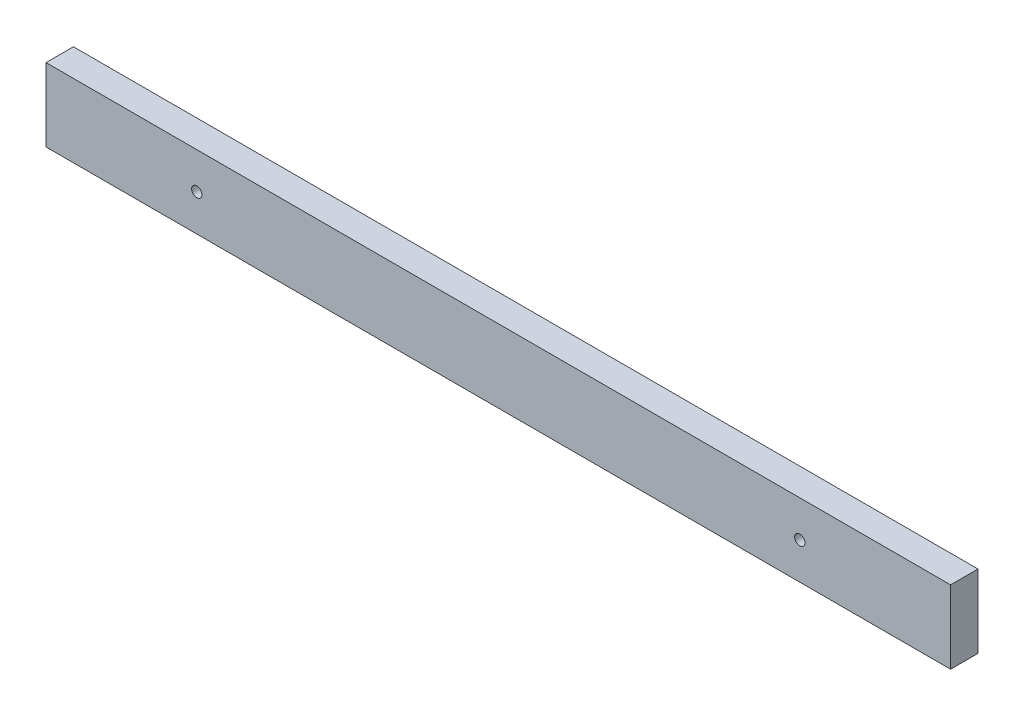
ISO-10303-21;
HEADER;
FILE_DESCRIPTION(('STEP AP214'),'2;1');
FILE_NAME('part.step','',(''),(''),'','','');
FILE_SCHEMA(('AUTOMOTIVE_DESIGN { 1 0 10303 214 1 1 1 1 }'));
ENDSEC;
DATA;
#1=APPLICATION_CONTEXT('core data for automotive mechanical design processes');
#2=APPLICATION_PROTOCOL_DEFINITION('international standard','automotive_design',2000,#1);
#3=PRODUCT_CONTEXT('',#1,'mechanical');
#4=PRODUCT('Part','Part','',(#3));
#5=PRODUCT_RELATED_PRODUCT_CATEGORY('part','',(#4));
#6=PRODUCT_DEFINITION_FORMATION('','',#4);
#7=PRODUCT_DEFINITION_CONTEXT('part definition',#1,'design');
#8=PRODUCT_DEFINITION('design','',#6,#7);
#9=PRODUCT_DEFINITION_SHAPE('','',#8);
#10=(LENGTH_UNIT() NAMED_UNIT(*) SI_UNIT(.MILLI.,.METRE.));
#11=(NAMED_UNIT(*) PLANE_ANGLE_UNIT() SI_UNIT($,.RADIAN.));
#12=(NAMED_UNIT(*) SI_UNIT($,.STERADIAN.) SOLID_ANGLE_UNIT());
#13=UNCERTAINTY_MEASURE_WITH_UNIT(LENGTH_MEASURE(1.E-05),#10,'distance_accuracy_value','');
#14=(GEOMETRIC_REPRESENTATION_CONTEXT(3) GLOBAL_UNCERTAINTY_ASSIGNED_CONTEXT((#13)) GLOBAL_UNIT_ASSIGNED_CONTEXT((#10,
#11,#12)) REPRESENTATION_CONTEXT('',''));
#15=CARTESIAN_POINT('',(0.,0.,0.));
#16=DIRECTION('',(0.,0.,1.));
#17=DIRECTION('',(1.,0.,0.));
#18=AXIS2_PLACEMENT_3D('',#15,#16,#17);
#19=CARTESIAN_POINT('',(-99.,16.,-3.));
#20=DIRECTION('',(1.,0.,0.));
#21=DIRECTION('',(0.,0.,-1.));
#22=AXIS2_PLACEMENT_3D('',#19,#20,#21);
#23=PLANE('',#22);
#24=DIRECTION('',(0.,0.,1.));
#25=VECTOR('',#24,1.);
#26=CARTESIAN_POINT('',(-99.,0.,-3.));
#27=LINE('',#26,#25);
#28=CARTESIAN_POINT('',(-99.,0.,-3.));
#29=VERTEX_POINT('',#28);
#30=CARTESIAN_POINT('',(-99.,0.,3.));
#31=VERTEX_POINT('',#30);
#32=EDGE_CURVE('E98',#29,#31,#27,.T.);
#33=ORIENTED_EDGE('',*,*,#32,.T.);
#34=DIRECTION('',(0.,-1.,0.));
#35=VECTOR('',#34,1.);
#36=CARTESIAN_POINT('',(-99.,16.,3.));
#37=LINE('',#36,#35);
#38=CARTESIAN_POINT('',(-99.,16.,3.));
#39=VERTEX_POINT('',#38);
#40=EDGE_CURVE('E11',#39,#31,#37,.T.);
#41=ORIENTED_EDGE('',*,*,#40,.F.);
#42=DIRECTION('',(0.,0.,1.));
#43=VECTOR('',#42,1.);
#44=CARTESIAN_POINT('',(-99.,16.,-3.));
#45=LINE('',#44,#43);
#46=CARTESIAN_POINT('',(-99.,16.,-3.));
#47=VERTEX_POINT('',#46);
#48=EDGE_CURVE('E85',#47,#39,#45,.T.);
#49=ORIENTED_EDGE('',*,*,#48,.F.);
#50=DIRECTION('',(0.,-1.,0.));
#51=VECTOR('',#50,1.);
#52=CARTESIAN_POINT('',(-99.,16.,-3.));
#53=LINE('',#52,#51);
#54=EDGE_CURVE('E94',#47,#29,#53,.T.);
#55=ORIENTED_EDGE('',*,*,#54,.T.);
#56=EDGE_LOOP('',(#33,#41,#49,#55));
#57=FACE_BOUND('',#56,.T.);
#58=ADVANCED_FACE('F32',(#57),#23,.F.);
#59=CARTESIAN_POINT('',(-99.,16.,3.));
#60=DIRECTION('',(0.,0.,-1.));
#61=DIRECTION('',(-1.,0.,0.));
#62=AXIS2_PLACEMENT_3D('',#59,#60,#61);
#63=PLANE('',#62);
#64=CARTESIAN_POINT('',(-66.,8.,3.));
#65=DIRECTION('',(0.,0.,1.));
#66=DIRECTION('',(1.,0.,0.));
#67=AXIS2_PLACEMENT_3D('',#64,#65,#66);
#68=CIRCLE('',#67,1.125);
#69=CARTESIAN_POINT('',(-64.875,8.,3.));
#70=VERTEX_POINT('',#69);
#71=EDGE_CURVE('E107',#70,#70,#68,.T.);
#72=ORIENTED_EDGE('',*,*,#71,.F.);
#73=EDGE_LOOP('',(#72));
#74=FACE_BOUND('',#73,.T.);
#75=CARTESIAN_POINT('',(66.,8.,3.));
#76=DIRECTION('',(0.,0.,1.));
#77=DIRECTION('',(1.,0.,0.));
#78=AXIS2_PLACEMENT_3D('',#75,#76,#77);
#79=CIRCLE('',#78,1.125);
#80=CARTESIAN_POINT('',(67.125,8.,3.));
#81=VERTEX_POINT('',#80);
#82=EDGE_CURVE('E112',#81,#81,#79,.T.);
#83=ORIENTED_EDGE('',*,*,#82,.F.);
#84=EDGE_LOOP('',(#83));
#85=FACE_BOUND('',#84,.T.);
#86=DIRECTION('',(1.,0.,0.));
#87=VECTOR('',#86,1.);
#88=CARTESIAN_POINT('',(-99.,0.,3.));
#89=LINE('',#88,#87);
#90=CARTESIAN_POINT('',(99.,0.,3.));
#91=VERTEX_POINT('',#90);
#92=EDGE_CURVE('E89',#31,#91,#89,.T.);
#93=ORIENTED_EDGE('',*,*,#92,.T.);
#94=DIRECTION('',(0.,-1.,0.));
#95=VECTOR('',#94,1.);
#96=CARTESIAN_POINT('',(99.,16.,3.));
#97=LINE('',#96,#95);
#98=CARTESIAN_POINT('',(99.,16.,3.));
#99=VERTEX_POINT('',#98);
#100=EDGE_CURVE('E41',#99,#91,#97,.T.);
#101=ORIENTED_EDGE('',*,*,#100,.F.);
#102=DIRECTION('',(1.,0.,0.));
#103=VECTOR('',#102,1.);
#104=CARTESIAN_POINT('',(-99.,16.,3.));
#105=LINE('',#104,#103);
#106=EDGE_CURVE('E80',#39,#99,#105,.T.);
#107=ORIENTED_EDGE('',*,*,#106,.F.);
#108=ORIENTED_EDGE('',*,*,#40,.T.);
#109=EDGE_LOOP('',(#93,#101,#107,#108));
#110=FACE_BOUND('',#109,.T.);
#111=ADVANCED_FACE('F88',(#74,#85,#110),#63,.F.);
#112=CARTESIAN_POINT('',(99.,16.,-3.));
#113=DIRECTION('',(-1.,0.,0.));
#114=DIRECTION('',(0.,0.,1.));
#115=AXIS2_PLACEMENT_3D('',#112,#113,#114);
#116=PLANE('',#115);
#117=DIRECTION('',(0.,0.,-1.));
#118=VECTOR('',#117,1.);
#119=CARTESIAN_POINT('',(99.,0.,-3.));
#120=LINE('',#119,#118);
#121=CARTESIAN_POINT('',(99.,0.,-3.));
#122=VERTEX_POINT('',#121);
#123=EDGE_CURVE('E67',#91,#122,#120,.T.);
#124=ORIENTED_EDGE('',*,*,#123,.T.);
#125=DIRECTION('',(0.,-1.,0.));
#126=VECTOR('',#125,1.);
#127=CARTESIAN_POINT('',(99.,16.,-3.));
#128=LINE('',#127,#126);
#129=CARTESIAN_POINT('',(99.,16.,-3.));
#130=VERTEX_POINT('',#129);
#131=EDGE_CURVE('E90',#130,#122,#128,.T.);
#132=ORIENTED_EDGE('',*,*,#131,.F.);
#133=DIRECTION('',(0.,0.,-1.));
#134=VECTOR('',#133,1.);
#135=CARTESIAN_POINT('',(99.,16.,-3.));
#136=LINE('',#135,#134);
#137=EDGE_CURVE('E83',#99,#130,#136,.T.);
#138=ORIENTED_EDGE('',*,*,#137,.F.);
#139=ORIENTED_EDGE('',*,*,#100,.T.);
#140=EDGE_LOOP('',(#124,#132,#138,#139));
#141=FACE_BOUND('',#140,.T.);
#142=ADVANCED_FACE('F92',(#141),#116,.F.);
#143=CARTESIAN_POINT('',(-99.,16.,-3.));
#144=DIRECTION('',(0.,0.,1.));
#145=DIRECTION('',(1.,0.,0.));
#146=AXIS2_PLACEMENT_3D('',#143,#144,#145);
#147=PLANE('',#146);
#148=CARTESIAN_POINT('',(-66.,8.,-3.));
#149=DIRECTION('',(0.,0.,1.));
#150=DIRECTION('',(1.,0.,0.));
#151=AXIS2_PLACEMENT_3D('',#148,#149,#150);
#152=CIRCLE('',#151,1.125);
#153=CARTESIAN_POINT('',(-64.875,8.,-3.));
#154=VERTEX_POINT('',#153);
#155=EDGE_CURVE('E35',#154,#154,#152,.T.);
#156=ORIENTED_EDGE('',*,*,#155,.T.);
#157=EDGE_LOOP('',(#156));
#158=FACE_BOUND('',#157,.T.);
#159=CARTESIAN_POINT('',(66.,8.,-3.));
#160=DIRECTION('',(0.,0.,1.));
#161=DIRECTION('',(1.,0.,0.));
#162=AXIS2_PLACEMENT_3D('',#159,#160,#161);
#163=CIRCLE('',#162,1.125);
#164=CARTESIAN_POINT('',(67.125,8.,-3.));
#165=VERTEX_POINT('',#164);
#166=EDGE_CURVE('E105',#165,#165,#163,.T.);
#167=ORIENTED_EDGE('',*,*,#166,.T.);
#168=EDGE_LOOP('',(#167));
#169=FACE_BOUND('',#168,.T.);
#170=DIRECTION('',(-1.,0.,0.));
#171=VECTOR('',#170,1.);
#172=CARTESIAN_POINT('',(-99.,0.,-3.));
#173=LINE('',#172,#171);
#174=EDGE_CURVE('E73',#122,#29,#173,.T.);
#175=ORIENTED_EDGE('',*,*,#174,.T.);
#176=ORIENTED_EDGE('',*,*,#54,.F.);
#177=DIRECTION('',(-1.,0.,0.));
#178=VECTOR('',#177,1.);
#179=CARTESIAN_POINT('',(-99.,16.,-3.));
#180=LINE('',#179,#178);
#181=EDGE_CURVE('E50',#130,#47,#180,.T.);
#182=ORIENTED_EDGE('',*,*,#181,.F.);
#183=ORIENTED_EDGE('',*,*,#131,.T.);
#184=EDGE_LOOP('',(#175,#176,#182,#183));
#185=FACE_BOUND('',#184,.T.);
#186=ADVANCED_FACE('F129',(#158,#169,#185),#147,.F.);
#187=CARTESIAN_POINT('',(0.,16.,0.));
#188=DIRECTION('',(0.,1.,0.));
#189=DIRECTION('',(0.,0.,1.));
#190=AXIS2_PLACEMENT_3D('',#187,#188,#189);
#191=PLANE('',#190);
#192=ORIENTED_EDGE('',*,*,#48,.T.);
#193=ORIENTED_EDGE('',*,*,#106,.T.);
#194=ORIENTED_EDGE('',*,*,#137,.T.);
#195=ORIENTED_EDGE('',*,*,#181,.T.);
#196=EDGE_LOOP('',(#192,#193,#194,#195));
#197=FACE_BOUND('',#196,.T.);
#198=ADVANCED_FACE('F81',(#197),#191,.T.);
#199=CARTESIAN_POINT('',(0.,0.,0.));
#200=DIRECTION('',(0.,1.,0.));
#201=DIRECTION('',(0.,0.,1.));
#202=AXIS2_PLACEMENT_3D('',#199,#200,#201);
#203=PLANE('',#202);
#204=ORIENTED_EDGE('',*,*,#32,.F.);
#205=ORIENTED_EDGE('',*,*,#174,.F.);
#206=ORIENTED_EDGE('',*,*,#123,.F.);
#207=ORIENTED_EDGE('',*,*,#92,.F.);
#208=EDGE_LOOP('',(#204,#205,#206,#207));
#209=FACE_BOUND('',#208,.T.);
#210=ADVANCED_FACE('F136',(#209),#203,.F.);
#211=CARTESIAN_POINT('',(66.,8.,-7.));
#212=DIRECTION('',(0.,0.,1.));
#213=DIRECTION('',(1.,0.,0.));
#214=AXIS2_PLACEMENT_3D('',#211,#212,#213);
#215=CYLINDRICAL_SURFACE('',#214,1.125);
#216=ORIENTED_EDGE('',*,*,#82,.T.);
#217=EDGE_LOOP('',(#216));
#218=FACE_BOUND('',#217,.T.);
#219=ORIENTED_EDGE('',*,*,#166,.F.);
#220=EDGE_LOOP('',(#219));
#221=FACE_BOUND('',#220,.T.);
#222=ADVANCED_FACE('F120',(#218,#221),#215,.F.);
#223=CARTESIAN_POINT('',(-66.,8.,-7.));
#224=DIRECTION('',(0.,0.,1.));
#225=DIRECTION('',(1.,0.,0.));
#226=AXIS2_PLACEMENT_3D('',#223,#224,#225);
#227=CYLINDRICAL_SURFACE('',#226,1.125);
#228=ORIENTED_EDGE('',*,*,#71,.T.);
#229=EDGE_LOOP('',(#228));
#230=FACE_BOUND('',#229,.T.);
#231=ORIENTED_EDGE('',*,*,#155,.F.);
#232=EDGE_LOOP('',(#231));
#233=FACE_BOUND('',#232,.T.);
#234=ADVANCED_FACE('F144',(#230,#233),#227,.F.);
#235=CLOSED_SHELL('',(#58,#111,#142,#186,#198,#210,#222,#234));
#236=MANIFOLD_SOLID_BREP('B2',#235);
#237=ADVANCED_BREP_SHAPE_REPRESENTATION('',(#18,#236),#14);
#238=SHAPE_DEFINITION_REPRESENTATION(#9,#237);
ENDSEC;
END-ISO-10303-21;
